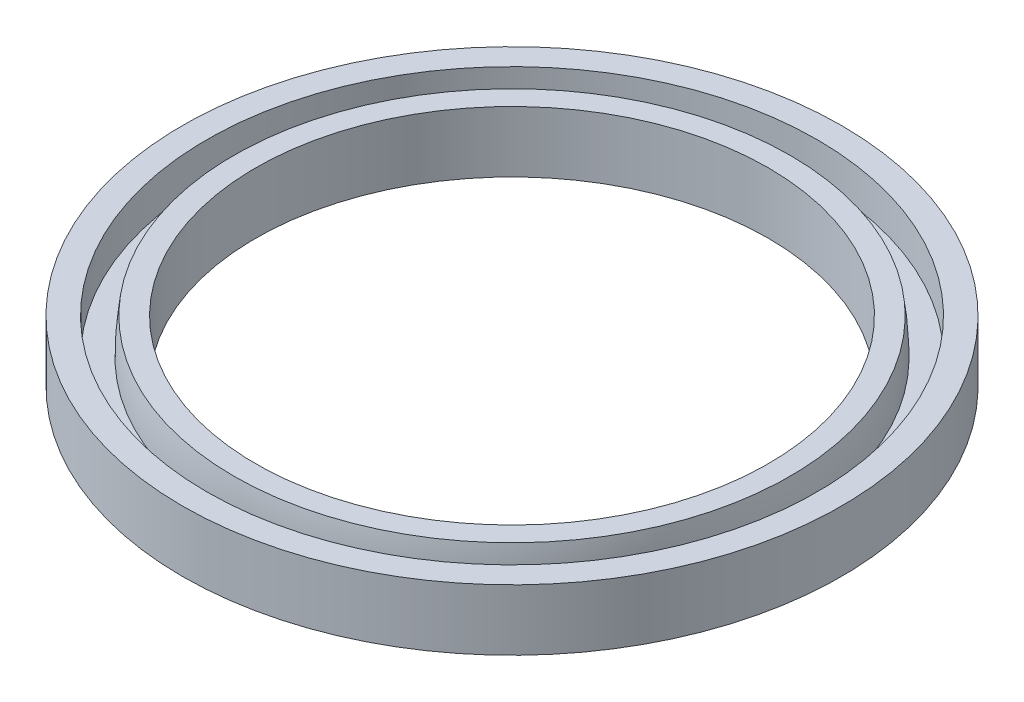
ISO-10303-21;
HEADER;
FILE_DESCRIPTION(('STEP AP214'),'2;1');
FILE_NAME('part.step','',(''),(''),'','','');
FILE_SCHEMA(('AUTOMOTIVE_DESIGN { 1 0 10303 214 1 1 1 1 }'));
ENDSEC;
DATA;
#1=APPLICATION_CONTEXT('core data for automotive mechanical design processes');
#2=APPLICATION_PROTOCOL_DEFINITION('international standard','automotive_design',2000,#1);
#3=PRODUCT_CONTEXT('',#1,'mechanical');
#4=PRODUCT('Part','Part','',(#3));
#5=PRODUCT_RELATED_PRODUCT_CATEGORY('part','',(#4));
#6=PRODUCT_DEFINITION_FORMATION('','',#4);
#7=PRODUCT_DEFINITION_CONTEXT('part definition',#1,'design');
#8=PRODUCT_DEFINITION('design','',#6,#7);
#9=PRODUCT_DEFINITION_SHAPE('','',#8);
#10=(LENGTH_UNIT() NAMED_UNIT(*) SI_UNIT(.MILLI.,.METRE.));
#11=(NAMED_UNIT(*) PLANE_ANGLE_UNIT() SI_UNIT($,.RADIAN.));
#12=(NAMED_UNIT(*) SI_UNIT($,.STERADIAN.) SOLID_ANGLE_UNIT());
#13=UNCERTAINTY_MEASURE_WITH_UNIT(LENGTH_MEASURE(1.E-05),#10,'distance_accuracy_value','');
#14=(GEOMETRIC_REPRESENTATION_CONTEXT(3) GLOBAL_UNCERTAINTY_ASSIGNED_CONTEXT((#13)) GLOBAL_UNIT_ASSIGNED_CONTEXT((#10,
#11,#12)) REPRESENTATION_CONTEXT('',''));
#15=CARTESIAN_POINT('',(0.,0.,0.));
#16=DIRECTION('',(0.,0.,1.));
#17=DIRECTION('',(1.,0.,0.));
#18=AXIS2_PLACEMENT_3D('',#15,#16,#17);
#19=CARTESIAN_POINT('',(0.,-564.589553779607,-1.93668275163386E-12));
#20=DIRECTION('',(0.,-1.,0.));
#21=DIRECTION('',(0.,0.,-1.));
#22=AXIS2_PLACEMENT_3D('',#19,#20,#21);
#23=CYLINDRICAL_SURFACE('',#22,21.);
#24=CARTESIAN_POINT('',(0.,-2.00000000000011,0.));
#25=DIRECTION('',(0.,-1.,0.));
#26=DIRECTION('',(0.,0.,-1.));
#27=AXIS2_PLACEMENT_3D('',#24,#25,#26);
#28=CIRCLE('',#27,21.);
#29=CARTESIAN_POINT('',(0.,-2.00000000000004,-21.));
#30=VERTEX_POINT('',#29);
#31=EDGE_CURVE('E63',#30,#30,#28,.T.);
#32=ORIENTED_EDGE('',*,*,#31,.T.);
#33=EDGE_LOOP('',(#32));
#34=FACE_BOUND('',#33,.T.);
#35=CARTESIAN_POINT('',(0.,2.99999999999989,0.));
#36=DIRECTION('',(0.,-1.,0.));
#37=DIRECTION('',(0.,0.,-1.));
#38=AXIS2_PLACEMENT_3D('',#35,#36,#37);
#39=CIRCLE('',#38,21.);
#40=CARTESIAN_POINT('',(0.,2.99999999999996,-21.));
#41=VERTEX_POINT('',#40);
#42=EDGE_CURVE('E10',#41,#41,#39,.T.);
#43=ORIENTED_EDGE('',*,*,#42,.F.);
#44=EDGE_LOOP('',(#43));
#45=FACE_BOUND('',#44,.T.);
#46=ADVANCED_FACE('F35',(#34,#45),#23,.F.);
#47=CARTESIAN_POINT('',(0.,3.,-21.));
#48=DIRECTION('',(0.,1.,0.));
#49=DIRECTION('',(0.,0.,1.));
#50=AXIS2_PLACEMENT_3D('',#47,#48,#49);
#51=PLANE('',#50);
#52=ORIENTED_EDGE('',*,*,#42,.T.);
#53=EDGE_LOOP('',(#52));
#54=FACE_BOUND('',#53,.T.);
#55=CARTESIAN_POINT('',(0.,2.99999999999989,0.));
#56=DIRECTION('',(0.,-1.,0.));
#57=DIRECTION('',(0.,0.,-1.));
#58=AXIS2_PLACEMENT_3D('',#55,#56,#57);
#59=CIRCLE('',#58,22.7785085019828);
#60=CARTESIAN_POINT('',(0.,2.99999999999997,-22.7785085019828));
#61=VERTEX_POINT('',#60);
#62=EDGE_CURVE('E41',#61,#61,#59,.T.);
#63=ORIENTED_EDGE('',*,*,#62,.F.);
#64=EDGE_LOOP('',(#63));
#65=FACE_BOUND('',#64,.T.);
#66=ADVANCED_FACE('F81',(#54,#65),#51,.T.);
#67=CARTESIAN_POINT('',(0.,-2.03309591384482E-12,0.));
#68=DIRECTION('',(0.,-1.,0.));
#69=DIRECTION('',(0.,0.,-1.));
#70=AXIS2_PLACEMENT_3D('',#67,#68,#69);
#71=DEGENERATE_TOROIDAL_SURFACE('',#70,2.57244732932912,20.4275526706709,.T.);
#72=ORIENTED_EDGE('',*,*,#62,.T.);
#73=EDGE_LOOP('',(#72));
#74=FACE_BOUND('',#73,.T.);
#75=CARTESIAN_POINT('',(0.,-1.11022302462516E-13,0.));
#76=DIRECTION('',(0.,-1.,0.));
#77=DIRECTION('',(0.,0.,-1.));
#78=AXIS2_PLACEMENT_3D('',#75,#76,#77);
#79=CIRCLE('',#78,23.);
#80=CARTESIAN_POINT('',(0.,0.,-23.));
#81=VERTEX_POINT('',#80);
#82=EDGE_CURVE('E45',#81,#81,#79,.T.);
#83=ORIENTED_EDGE('',*,*,#82,.F.);
#84=EDGE_LOOP('',(#83));
#85=FACE_BOUND('',#84,.T.);
#86=ADVANCED_FACE('F85',(#74,#85),#71,.T.);
#87=CARTESIAN_POINT('',(0.,0.,-23.));
#88=DIRECTION('',(0.,1.,0.));
#89=DIRECTION('',(0.,0.,1.));
#90=AXIS2_PLACEMENT_3D('',#87,#88,#89);
#91=PLANE('',#90);
#92=ORIENTED_EDGE('',*,*,#82,.T.);
#93=EDGE_LOOP('',(#92));
#94=FACE_BOUND('',#93,.T.);
#95=CARTESIAN_POINT('',(0.,-1.11022302462516E-13,0.));
#96=DIRECTION('',(0.,-1.,0.));
#97=DIRECTION('',(0.,0.,-1.));
#98=AXIS2_PLACEMENT_3D('',#95,#96,#97);
#99=CIRCLE('',#98,25.);
#100=CARTESIAN_POINT('',(0.,0.,-25.));
#101=VERTEX_POINT('',#100);
#102=EDGE_CURVE('E49',#101,#101,#99,.T.);
#103=ORIENTED_EDGE('',*,*,#102,.F.);
#104=EDGE_LOOP('',(#103));
#105=FACE_BOUND('',#104,.T.);
#106=ADVANCED_FACE('F89',(#94,#105),#91,.T.);
#107=CARTESIAN_POINT('',(0.,-564.589553779607,-1.93668275163386E-12));
#108=DIRECTION('',(0.,-1.,0.));
#109=DIRECTION('',(0.,0.,-1.));
#110=AXIS2_PLACEMENT_3D('',#107,#108,#109);
#111=CYLINDRICAL_SURFACE('',#110,25.);
#112=ORIENTED_EDGE('',*,*,#102,.T.);
#113=EDGE_LOOP('',(#112));
#114=FACE_BOUND('',#113,.T.);
#115=CARTESIAN_POINT('',(0.,2.99999999999989,0.));
#116=DIRECTION('',(0.,-1.,0.));
#117=DIRECTION('',(0.,0.,-1.));
#118=AXIS2_PLACEMENT_3D('',#115,#116,#117);
#119=CIRCLE('',#118,25.);
#120=CARTESIAN_POINT('',(0.,2.99999999999998,-25.));
#121=VERTEX_POINT('',#120);
#122=EDGE_CURVE('E54',#121,#121,#119,.T.);
#123=ORIENTED_EDGE('',*,*,#122,.F.);
#124=EDGE_LOOP('',(#123));
#125=FACE_BOUND('',#124,.T.);
#126=ADVANCED_FACE('F95',(#114,#125),#111,.F.);
#127=CARTESIAN_POINT('',(0.,3.,-25.));
#128=DIRECTION('',(0.,1.,0.));
#129=DIRECTION('',(0.,0.,1.));
#130=AXIS2_PLACEMENT_3D('',#127,#128,#129);
#131=PLANE('',#130);
#132=ORIENTED_EDGE('',*,*,#122,.T.);
#133=EDGE_LOOP('',(#132));
#134=FACE_BOUND('',#133,.T.);
#135=CARTESIAN_POINT('',(0.,2.99999999999989,0.));
#136=DIRECTION('',(0.,-1.,0.));
#137=DIRECTION('',(0.,0.,-1.));
#138=AXIS2_PLACEMENT_3D('',#135,#136,#137);
#139=CIRCLE('',#138,27.);
#140=CARTESIAN_POINT('',(0.,2.99999999999998,-27.));
#141=VERTEX_POINT('',#140);
#142=EDGE_CURVE('E57',#141,#141,#139,.T.);
#143=ORIENTED_EDGE('',*,*,#142,.F.);
#144=EDGE_LOOP('',(#143));
#145=FACE_BOUND('',#144,.T.);
#146=ADVANCED_FACE('F77',(#134,#145),#131,.T.);
#147=CARTESIAN_POINT('',(0.,-564.589553779607,-1.93668275163386E-12));
#148=DIRECTION('',(0.,-1.,0.));
#149=DIRECTION('',(0.,0.,-1.));
#150=AXIS2_PLACEMENT_3D('',#147,#148,#149);
#151=CYLINDRICAL_SURFACE('',#150,27.);
#152=ORIENTED_EDGE('',*,*,#142,.T.);
#153=EDGE_LOOP('',(#152));
#154=FACE_BOUND('',#153,.T.);
#155=CARTESIAN_POINT('',(0.,-2.00000000000011,0.));
#156=DIRECTION('',(0.,-1.,0.));
#157=DIRECTION('',(0.,0.,-1.));
#158=AXIS2_PLACEMENT_3D('',#155,#156,#157);
#159=CIRCLE('',#158,27.);
#160=CARTESIAN_POINT('',(0.,-2.00000000000002,-27.));
#161=VERTEX_POINT('',#160);
#162=EDGE_CURVE('E60',#161,#161,#159,.T.);
#163=ORIENTED_EDGE('',*,*,#162,.F.);
#164=EDGE_LOOP('',(#163));
#165=FACE_BOUND('',#164,.T.);
#166=ADVANCED_FACE('F71',(#154,#165),#151,.T.);
#167=CARTESIAN_POINT('',(0.,-2.00000000000001,-21.));
#168=DIRECTION('',(0.,-1.,0.));
#169=DIRECTION('',(0.,0.,-1.));
#170=AXIS2_PLACEMENT_3D('',#167,#168,#169);
#171=PLANE('',#170);
#172=ORIENTED_EDGE('',*,*,#162,.T.);
#173=EDGE_LOOP('',(#172));
#174=FACE_BOUND('',#173,.T.);
#175=ORIENTED_EDGE('',*,*,#31,.F.);
#176=EDGE_LOOP('',(#175));
#177=FACE_BOUND('',#176,.T.);
#178=ADVANCED_FACE('F69',(#174,#177),#171,.T.);
#179=CLOSED_SHELL('',(#46,#66,#86,#106,#126,#146,#166,#178));
#180=MANIFOLD_SOLID_BREP('B2',#179);
#181=ADVANCED_BREP_SHAPE_REPRESENTATION('',(#18,#180),#14);
#182=SHAPE_DEFINITION_REPRESENTATION(#9,#181);
ENDSEC;
END-ISO-10303-21;
